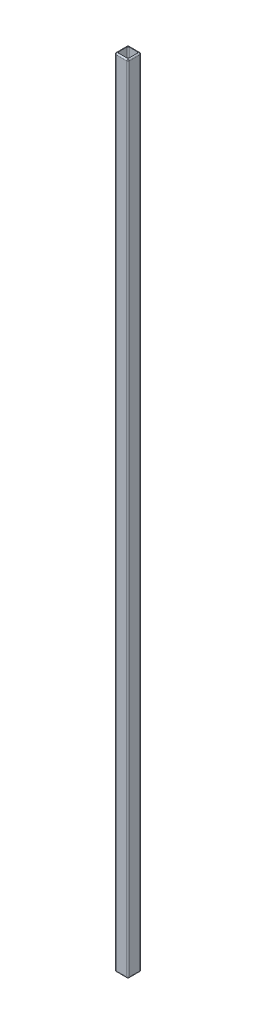
ISO-10303-21;
HEADER;
FILE_DESCRIPTION(('STEP AP214'),'2;1');
FILE_NAME('part.step','',(''),(''),'','','');
FILE_SCHEMA(('AUTOMOTIVE_DESIGN { 1 0 10303 214 1 1 1 1 }'));
ENDSEC;
DATA;
#1=APPLICATION_CONTEXT('core data for automotive mechanical design processes');
#2=APPLICATION_PROTOCOL_DEFINITION('international standard','automotive_design',2000,#1);
#3=PRODUCT_CONTEXT('',#1,'mechanical');
#4=PRODUCT('Part','Part','',(#3));
#5=PRODUCT_RELATED_PRODUCT_CATEGORY('part','',(#4));
#6=PRODUCT_DEFINITION_FORMATION('','',#4);
#7=PRODUCT_DEFINITION_CONTEXT('part definition',#1,'design');
#8=PRODUCT_DEFINITION('design','',#6,#7);
#9=PRODUCT_DEFINITION_SHAPE('','',#8);
#10=(LENGTH_UNIT() NAMED_UNIT(*) SI_UNIT(.MILLI.,.METRE.));
#11=(NAMED_UNIT(*) PLANE_ANGLE_UNIT() SI_UNIT($,.RADIAN.));
#12=(NAMED_UNIT(*) SI_UNIT($,.STERADIAN.) SOLID_ANGLE_UNIT());
#13=UNCERTAINTY_MEASURE_WITH_UNIT(LENGTH_MEASURE(1.E-05),#10,'distance_accuracy_value','');
#14=(GEOMETRIC_REPRESENTATION_CONTEXT(3) GLOBAL_UNCERTAINTY_ASSIGNED_CONTEXT((#13)) GLOBAL_UNIT_ASSIGNED_CONTEXT((#10,
#11,#12)) REPRESENTATION_CONTEXT('',''));
#15=CARTESIAN_POINT('',(0.,0.,0.));
#16=DIRECTION('',(0.,0.,1.));
#17=DIRECTION('',(1.,0.,0.));
#18=AXIS2_PLACEMENT_3D('',#15,#16,#17);
#19=CARTESIAN_POINT('',(0.,0.,0.));
#20=DIRECTION('',(0.,1.,0.));
#21=DIRECTION('',(0.,0.,1.));
#22=AXIS2_PLACEMENT_3D('',#19,#20,#21);
#23=PLANE('',#22);
#24=CARTESIAN_POINT('',(-7.62,0.,7.61999999999999));
#25=DIRECTION('',(0.,1.,0.));
#26=DIRECTION('',(0.,0.,1.));
#27=AXIS2_PLACEMENT_3D('',#24,#25,#26);
#28=CIRCLE('',#27,2.54);
#29=CARTESIAN_POINT('',(-10.16,0.,7.61999999999999));
#30=VERTEX_POINT('',#29);
#31=CARTESIAN_POINT('',(-7.62,0.,10.16));
#32=VERTEX_POINT('',#31);
#33=EDGE_CURVE('E283',#30,#32,#28,.T.);
#34=ORIENTED_EDGE('',*,*,#33,.T.);
#35=DIRECTION('',(-1.,0.,0.));
#36=VECTOR('',#35,1.);
#37=CARTESIAN_POINT('',(-10.16,0.,10.16));
#38=LINE('',#37,#36);
#39=CARTESIAN_POINT('',(-10.16,0.,10.16));
#40=VERTEX_POINT('',#39);
#41=EDGE_CURVE('E56',#32,#40,#38,.T.);
#42=ORIENTED_EDGE('',*,*,#41,.T.);
#43=DIRECTION('',(0.,0.,1.));
#44=VECTOR('',#43,1.);
#45=CARTESIAN_POINT('',(-10.16,0.,0.));
#46=LINE('',#45,#44);
#47=EDGE_CURVE('E363',#40,#30,#46,.F.);
#48=ORIENTED_EDGE('',*,*,#47,.T.);
#49=EDGE_LOOP('',(#34,#42,#48));
#50=FACE_BOUND('',#49,.T.);
#51=ADVANCED_FACE('F39',(#50),#23,.F.);
#52=DIRECTION('',(0.,0.,1.));
#53=VECTOR('',#52,1.);
#54=CARTESIAN_POINT('',(10.16,0.,10.16));
#55=LINE('',#54,#53);
#56=CARTESIAN_POINT('',(10.16,0.,7.61999999999999));
#57=VERTEX_POINT('',#56);
#58=CARTESIAN_POINT('',(10.16,0.,10.16));
#59=VERTEX_POINT('',#58);
#60=EDGE_CURVE('E64',#57,#59,#55,.T.);
#61=ORIENTED_EDGE('',*,*,#60,.T.);
#62=DIRECTION('',(-1.,0.,0.));
#63=VECTOR('',#62,1.);
#64=CARTESIAN_POINT('',(-10.16,0.,10.16));
#65=LINE('',#64,#63);
#66=CARTESIAN_POINT('',(7.62,0.,10.16));
#67=VERTEX_POINT('',#66);
#68=EDGE_CURVE('E361',#59,#67,#65,.T.);
#69=ORIENTED_EDGE('',*,*,#68,.T.);
#70=CARTESIAN_POINT('',(7.62,0.,7.61999999999999));
#71=DIRECTION('',(0.,1.,0.));
#72=DIRECTION('',(0.,0.,1.));
#73=AXIS2_PLACEMENT_3D('',#70,#71,#72);
#74=CIRCLE('',#73,2.54);
#75=EDGE_CURVE('E287',#67,#57,#74,.T.);
#76=ORIENTED_EDGE('',*,*,#75,.T.);
#77=EDGE_LOOP('',(#61,#69,#76));
#78=FACE_BOUND('',#77,.T.);
#79=ADVANCED_FACE('F467',(#78),#23,.F.);
#80=CARTESIAN_POINT('',(-7.62,0.,-7.62));
#81=DIRECTION('',(0.,1.,0.));
#82=DIRECTION('',(0.,0.,1.));
#83=AXIS2_PLACEMENT_3D('',#80,#81,#82);
#84=CIRCLE('',#83,2.54);
#85=CARTESIAN_POINT('',(-7.62,0.,-10.16));
#86=VERTEX_POINT('',#85);
#87=CARTESIAN_POINT('',(-10.16,0.,-7.62));
#88=VERTEX_POINT('',#87);
#89=EDGE_CURVE('E180',#86,#88,#84,.T.);
#90=ORIENTED_EDGE('',*,*,#89,.T.);
#91=DIRECTION('',(0.,0.,1.));
#92=VECTOR('',#91,1.);
#93=CARTESIAN_POINT('',(-10.16,0.,0.));
#94=LINE('',#93,#92);
#95=CARTESIAN_POINT('',(-10.16,0.,-10.16));
#96=VERTEX_POINT('',#95);
#97=EDGE_CURVE('E183',#88,#96,#94,.F.);
#98=ORIENTED_EDGE('',*,*,#97,.T.);
#99=DIRECTION('',(-1.,0.,0.));
#100=VECTOR('',#99,1.);
#101=CARTESIAN_POINT('',(0.,0.,-10.16));
#102=LINE('',#101,#100);
#103=EDGE_CURVE('E177',#96,#86,#102,.F.);
#104=ORIENTED_EDGE('',*,*,#103,.T.);
#105=EDGE_LOOP('',(#90,#98,#104));
#106=FACE_BOUND('',#105,.T.);
#107=ADVANCED_FACE('F179',(#106),#23,.F.);
#108=CARTESIAN_POINT('',(0.,1524.,0.));
#109=DIRECTION('',(0.,1.,0.));
#110=DIRECTION('',(0.,0.,1.));
#111=AXIS2_PLACEMENT_3D('',#108,#109,#110);
#112=PLANE('',#111);
#113=DIRECTION('',(0.,0.,1.));
#114=VECTOR('',#113,1.);
#115=CARTESIAN_POINT('',(-10.16,1524.,10.16));
#116=LINE('',#115,#114);
#117=CARTESIAN_POINT('',(-10.16,1524.,7.61999999999999));
#118=VERTEX_POINT('',#117);
#119=CARTESIAN_POINT('',(-10.16,1524.,10.16));
#120=VERTEX_POINT('',#119);
#121=EDGE_CURVE('E317',#118,#120,#116,.T.);
#122=ORIENTED_EDGE('',*,*,#121,.T.);
#123=DIRECTION('',(-1.,0.,0.));
#124=VECTOR('',#123,1.);
#125=CARTESIAN_POINT('',(0.,1524.,10.16));
#126=LINE('',#125,#124);
#127=CARTESIAN_POINT('',(-7.62,1524.,10.16));
#128=VERTEX_POINT('',#127);
#129=EDGE_CURVE('E319',#120,#128,#126,.F.);
#130=ORIENTED_EDGE('',*,*,#129,.T.);
#131=CARTESIAN_POINT('',(-7.62,1524.,7.61999999999999));
#132=DIRECTION('',(0.,1.,0.));
#133=DIRECTION('',(0.,0.,1.));
#134=AXIS2_PLACEMENT_3D('',#131,#132,#133);
#135=CIRCLE('',#134,2.54);
#136=EDGE_CURVE('E285',#128,#118,#135,.F.);
#137=ORIENTED_EDGE('',*,*,#136,.T.);
#138=EDGE_LOOP('',(#122,#130,#137));
#139=FACE_BOUND('',#138,.T.);
#140=ADVANCED_FACE('F438',(#139),#112,.T.);
#141=DIRECTION('',(-1.,0.,0.));
#142=VECTOR('',#141,1.);
#143=CARTESIAN_POINT('',(-10.16,1524.,-10.16));
#144=LINE('',#143,#142);
#145=CARTESIAN_POINT('',(-7.62,1524.,-10.16));
#146=VERTEX_POINT('',#145);
#147=CARTESIAN_POINT('',(-10.16,1524.,-10.16));
#148=VERTEX_POINT('',#147);
#149=EDGE_CURVE('E313',#146,#148,#144,.T.);
#150=ORIENTED_EDGE('',*,*,#149,.T.);
#151=DIRECTION('',(0.,0.,1.));
#152=VECTOR('',#151,1.);
#153=CARTESIAN_POINT('',(-10.16,1524.,10.16));
#154=LINE('',#153,#152);
#155=CARTESIAN_POINT('',(-10.16,1524.,-7.62));
#156=VERTEX_POINT('',#155);
#157=EDGE_CURVE('E315',#148,#156,#154,.T.);
#158=ORIENTED_EDGE('',*,*,#157,.T.);
#159=CARTESIAN_POINT('',(-7.62,1524.,-7.62));
#160=DIRECTION('',(0.,1.,0.));
#161=DIRECTION('',(0.,0.,1.));
#162=AXIS2_PLACEMENT_3D('',#159,#160,#161);
#163=CIRCLE('',#162,2.54);
#164=EDGE_CURVE('E200',#156,#146,#163,.F.);
#165=ORIENTED_EDGE('',*,*,#164,.T.);
#166=EDGE_LOOP('',(#150,#158,#165));
#167=FACE_BOUND('',#166,.T.);
#168=ADVANCED_FACE('F490',(#167),#112,.T.);
#169=CARTESIAN_POINT('',(7.62,1524.,7.61999999999999));
#170=DIRECTION('',(0.,1.,0.));
#171=DIRECTION('',(0.,0.,1.));
#172=AXIS2_PLACEMENT_3D('',#169,#170,#171);
#173=CIRCLE('',#172,2.54);
#174=CARTESIAN_POINT('',(10.16,1524.,7.61999999999999));
#175=VERTEX_POINT('',#174);
#176=CARTESIAN_POINT('',(7.62,1524.,10.16));
#177=VERTEX_POINT('',#176);
#178=EDGE_CURVE('E289',#175,#177,#173,.F.);
#179=ORIENTED_EDGE('',*,*,#178,.T.);
#180=DIRECTION('',(-1.,0.,0.));
#181=VECTOR('',#180,1.);
#182=CARTESIAN_POINT('',(0.,1524.,10.16));
#183=LINE('',#182,#181);
#184=CARTESIAN_POINT('',(10.16,1524.,10.16));
#185=VERTEX_POINT('',#184);
#186=EDGE_CURVE('E311',#177,#185,#183,.F.);
#187=ORIENTED_EDGE('',*,*,#186,.T.);
#188=DIRECTION('',(0.,0.,1.));
#189=VECTOR('',#188,1.);
#190=CARTESIAN_POINT('',(10.16,1524.,0.));
#191=LINE('',#190,#189);
#192=EDGE_CURVE('E309',#185,#175,#191,.F.);
#193=ORIENTED_EDGE('',*,*,#192,.T.);
#194=EDGE_LOOP('',(#179,#187,#193));
#195=FACE_BOUND('',#194,.T.);
#196=ADVANCED_FACE('F424',(#195),#112,.T.);
#197=CARTESIAN_POINT('',(12.7,1524.,-12.7));
#198=DIRECTION('',(0.,0.,1.));
#199=DIRECTION('',(1.,0.,0.));
#200=AXIS2_PLACEMENT_3D('',#197,#198,#199);
#201=PLANE('',#200);
#202=DIRECTION('',(0.,-1.,0.));
#203=VECTOR('',#202,1.);
#204=CARTESIAN_POINT('',(10.16,0.,-12.7));
#205=LINE('',#204,#203);
#206=CARTESIAN_POINT('',(10.16,1521.46,-12.7));
#207=VERTEX_POINT('',#206);
#208=CARTESIAN_POINT('',(10.16,2.53999999999999,-12.7));
#209=VERTEX_POINT('',#208);
#210=EDGE_CURVE('E211',#207,#209,#205,.T.);
#211=ORIENTED_EDGE('',*,*,#210,.T.);
#212=DIRECTION('',(-1.,0.,0.));
#213=VECTOR('',#212,1.);
#214=CARTESIAN_POINT('',(12.7,2.53999999999999,-12.7));
#215=LINE('',#214,#213);
#216=CARTESIAN_POINT('',(-10.16,2.53999999999999,-12.7));
#217=VERTEX_POINT('',#216);
#218=EDGE_CURVE('E11',#209,#217,#215,.T.);
#219=ORIENTED_EDGE('',*,*,#218,.T.);
#220=DIRECTION('',(0.,-1.,0.));
#221=VECTOR('',#220,1.);
#222=CARTESIAN_POINT('',(-10.16,1524.,-12.7));
#223=LINE('',#222,#221);
#224=CARTESIAN_POINT('',(-10.16,1521.46,-12.7));
#225=VERTEX_POINT('',#224);
#226=EDGE_CURVE('E256',#217,#225,#223,.F.);
#227=ORIENTED_EDGE('',*,*,#226,.T.);
#228=DIRECTION('',(-1.,0.,0.));
#229=VECTOR('',#228,1.);
#230=CARTESIAN_POINT('',(10.16,1521.46,-12.7));
#231=LINE('',#230,#229);
#232=EDGE_CURVE('E324',#225,#207,#231,.F.);
#233=ORIENTED_EDGE('',*,*,#232,.T.);
#234=EDGE_LOOP('',(#211,#219,#227,#233));
#235=FACE_BOUND('',#234,.T.);
#236=ADVANCED_FACE('F514',(#235),#201,.F.);
#237=CARTESIAN_POINT('',(-12.7,1524.,-12.7));
#238=DIRECTION('',(1.,0.,0.));
#239=DIRECTION('',(0.,0.,-1.));
#240=AXIS2_PLACEMENT_3D('',#237,#238,#239);
#241=PLANE('',#240);
#242=DIRECTION('',(0.,-1.,0.));
#243=VECTOR('',#242,1.);
#244=CARTESIAN_POINT('',(-12.7,1524.,-10.16));
#245=LINE('',#244,#243);
#246=CARTESIAN_POINT('',(-12.7,1521.46,-10.16));
#247=VERTEX_POINT('',#246);
#248=CARTESIAN_POINT('',(-12.7,2.53999999999999,-10.16));
#249=VERTEX_POINT('',#248);
#250=EDGE_CURVE('E246',#247,#249,#245,.T.);
#251=ORIENTED_EDGE('',*,*,#250,.T.);
#252=DIRECTION('',(0.,0.,1.));
#253=VECTOR('',#252,1.);
#254=CARTESIAN_POINT('',(-12.7,2.53999999999999,-12.7));
#255=LINE('',#254,#253);
#256=CARTESIAN_POINT('',(-12.7,2.53999999999999,10.16));
#257=VERTEX_POINT('',#256);
#258=EDGE_CURVE('E368',#249,#257,#255,.T.);
#259=ORIENTED_EDGE('',*,*,#258,.T.);
#260=DIRECTION('',(0.,-1.,0.));
#261=VECTOR('',#260,1.);
#262=CARTESIAN_POINT('',(-12.7,1524.,10.16));
#263=LINE('',#262,#261);
#264=CARTESIAN_POINT('',(-12.7,1521.46,10.16));
#265=VERTEX_POINT('',#264);
#266=EDGE_CURVE('E249',#257,#265,#263,.F.);
#267=ORIENTED_EDGE('',*,*,#266,.T.);
#268=DIRECTION('',(0.,0.,1.));
#269=VECTOR('',#268,1.);
#270=CARTESIAN_POINT('',(-12.7,1521.46,-10.16));
#271=LINE('',#270,#269);
#272=EDGE_CURVE('E322',#265,#247,#271,.F.);
#273=ORIENTED_EDGE('',*,*,#272,.T.);
#274=EDGE_LOOP('',(#251,#259,#267,#273));
#275=FACE_BOUND('',#274,.T.);
#276=ADVANCED_FACE('F628',(#275),#241,.F.);
#277=CARTESIAN_POINT('',(12.7,1524.,12.7));
#278=DIRECTION('',(0.,0.,1.));
#279=DIRECTION('',(1.,0.,0.));
#280=AXIS2_PLACEMENT_3D('',#277,#278,#279);
#281=PLANE('',#280);
#282=DIRECTION('',(0.,-1.,0.));
#283=VECTOR('',#282,1.);
#284=CARTESIAN_POINT('',(-10.16,0.,12.7));
#285=LINE('',#284,#283);
#286=CARTESIAN_POINT('',(-10.16,1521.46,12.7));
#287=VERTEX_POINT('',#286);
#288=CARTESIAN_POINT('',(-10.16,2.54,12.7));
#289=VERTEX_POINT('',#288);
#290=EDGE_CURVE('E243',#287,#289,#285,.T.);
#291=ORIENTED_EDGE('',*,*,#290,.T.);
#292=DIRECTION('',(-1.,0.,0.));
#293=VECTOR('',#292,1.);
#294=CARTESIAN_POINT('',(10.16,2.54,12.7));
#295=LINE('',#294,#293);
#296=CARTESIAN_POINT('',(10.16,2.53999999999999,12.7));
#297=VERTEX_POINT('',#296);
#298=EDGE_CURVE('E366',#289,#297,#295,.F.);
#299=ORIENTED_EDGE('',*,*,#298,.T.);
#300=DIRECTION('',(0.,-1.,0.));
#301=VECTOR('',#300,1.);
#302=CARTESIAN_POINT('',(10.16,1524.,12.7));
#303=LINE('',#302,#301);
#304=CARTESIAN_POINT('',(10.16,1521.46,12.7));
#305=VERTEX_POINT('',#304);
#306=EDGE_CURVE('E241',#297,#305,#303,.F.);
#307=ORIENTED_EDGE('',*,*,#306,.T.);
#308=DIRECTION('',(-1.,0.,0.));
#309=VECTOR('',#308,1.);
#310=CARTESIAN_POINT('',(12.7,1521.46,12.7));
#311=LINE('',#310,#309);
#312=EDGE_CURVE('E303',#305,#287,#311,.T.);
#313=ORIENTED_EDGE('',*,*,#312,.T.);
#314=EDGE_LOOP('',(#291,#299,#307,#313));
#315=FACE_BOUND('',#314,.T.);
#316=ADVANCED_FACE('F404',(#315),#281,.T.);
#317=CARTESIAN_POINT('',(12.7,1524.,-12.7));
#318=DIRECTION('',(1.,0.,0.));
#319=DIRECTION('',(0.,0.,-1.));
#320=AXIS2_PLACEMENT_3D('',#317,#318,#319);
#321=PLANE('',#320);
#322=DIRECTION('',(0.,-1.,0.));
#323=VECTOR('',#322,1.);
#324=CARTESIAN_POINT('',(12.7,1524.,10.16));
#325=LINE('',#324,#323);
#326=CARTESIAN_POINT('',(12.7,1521.46,10.16));
#327=VERTEX_POINT('',#326);
#328=CARTESIAN_POINT('',(12.7,2.53999999999999,10.16));
#329=VERTEX_POINT('',#328);
#330=EDGE_CURVE('E253',#327,#329,#325,.T.);
#331=ORIENTED_EDGE('',*,*,#330,.T.);
#332=DIRECTION('',(0.,0.,1.));
#333=VECTOR('',#332,1.);
#334=CARTESIAN_POINT('',(12.7,2.54,-10.16));
#335=LINE('',#334,#333);
#336=CARTESIAN_POINT('',(12.7,2.53999999999999,-10.16));
#337=VERTEX_POINT('',#336);
#338=EDGE_CURVE('E48',#329,#337,#335,.F.);
#339=ORIENTED_EDGE('',*,*,#338,.T.);
#340=DIRECTION('',(0.,-1.,0.));
#341=VECTOR('',#340,1.);
#342=CARTESIAN_POINT('',(12.7,1524.,-10.16));
#343=LINE('',#342,#341);
#344=CARTESIAN_POINT('',(12.7,1521.46,-10.16));
#345=VERTEX_POINT('',#344);
#346=EDGE_CURVE('E251',#337,#345,#343,.F.);
#347=ORIENTED_EDGE('',*,*,#346,.T.);
#348=DIRECTION('',(0.,0.,1.));
#349=VECTOR('',#348,1.);
#350=CARTESIAN_POINT('',(12.7,1521.46,-12.7));
#351=LINE('',#350,#349);
#352=EDGE_CURVE('E326',#345,#327,#351,.T.);
#353=ORIENTED_EDGE('',*,*,#352,.T.);
#354=EDGE_LOOP('',(#331,#339,#347,#353));
#355=FACE_BOUND('',#354,.T.);
#356=ADVANCED_FACE('F484',(#355),#321,.T.);
#357=DIRECTION('',(0.,0.,1.));
#358=VECTOR('',#357,1.);
#359=CARTESIAN_POINT('',(10.16,1524.,0.));
#360=LINE('',#359,#358);
#361=CARTESIAN_POINT('',(10.16,1524.,-7.62));
#362=VERTEX_POINT('',#361);
#363=CARTESIAN_POINT('',(10.16,1524.,-10.16));
#364=VERTEX_POINT('',#363);
#365=EDGE_CURVE('E305',#362,#364,#360,.F.);
#366=ORIENTED_EDGE('',*,*,#365,.T.);
#367=DIRECTION('',(-1.,0.,0.));
#368=VECTOR('',#367,1.);
#369=CARTESIAN_POINT('',(-10.16,1524.,-10.16));
#370=LINE('',#369,#368);
#371=CARTESIAN_POINT('',(7.62,1524.,-10.16));
#372=VERTEX_POINT('',#371);
#373=EDGE_CURVE('E307',#364,#372,#370,.T.);
#374=ORIENTED_EDGE('',*,*,#373,.T.);
#375=CARTESIAN_POINT('',(7.62,1524.,-7.62));
#376=DIRECTION('',(0.,1.,0.));
#377=DIRECTION('',(0.,0.,1.));
#378=AXIS2_PLACEMENT_3D('',#375,#376,#377);
#379=CIRCLE('',#378,2.54);
#380=EDGE_CURVE('E281',#372,#362,#379,.F.);
#381=ORIENTED_EDGE('',*,*,#380,.T.);
#382=EDGE_LOOP('',(#366,#374,#381));
#383=FACE_BOUND('',#382,.T.);
#384=ADVANCED_FACE('F476',(#383),#112,.T.);
#385=DIRECTION('',(-1.,0.,0.));
#386=VECTOR('',#385,1.);
#387=CARTESIAN_POINT('',(0.,0.,-10.16));
#388=LINE('',#387,#386);
#389=CARTESIAN_POINT('',(7.62,0.,-10.16));
#390=VERTEX_POINT('',#389);
#391=CARTESIAN_POINT('',(10.16,0.,-10.16));
#392=VERTEX_POINT('',#391);
#393=EDGE_CURVE('E216',#390,#392,#388,.F.);
#394=ORIENTED_EDGE('',*,*,#393,.T.);
#395=DIRECTION('',(0.,0.,1.));
#396=VECTOR('',#395,1.);
#397=CARTESIAN_POINT('',(10.16,0.,10.16));
#398=LINE('',#397,#396);
#399=CARTESIAN_POINT('',(10.16,0.,-7.62));
#400=VERTEX_POINT('',#399);
#401=EDGE_CURVE('E188',#392,#400,#398,.T.);
#402=ORIENTED_EDGE('',*,*,#401,.T.);
#403=CARTESIAN_POINT('',(7.62,0.,-7.62));
#404=DIRECTION('',(0.,1.,0.));
#405=DIRECTION('',(0.,0.,1.));
#406=AXIS2_PLACEMENT_3D('',#403,#404,#405);
#407=CIRCLE('',#406,2.54);
#408=EDGE_CURVE('E279',#400,#390,#407,.T.);
#409=ORIENTED_EDGE('',*,*,#408,.T.);
#410=EDGE_LOOP('',(#394,#402,#409));
#411=FACE_BOUND('',#410,.T.);
#412=ADVANCED_FACE('F469',(#411),#23,.F.);
#413=CARTESIAN_POINT('',(12.7,1524.,-10.16));
#414=DIRECTION('',(0.,0.,1.));
#415=DIRECTION('',(1.,0.,0.));
#416=AXIS2_PLACEMENT_3D('',#413,#414,#415);
#417=PLANE('',#416);
#418=DIRECTION('',(-1.,0.,0.));
#419=VECTOR('',#418,1.);
#420=CARTESIAN_POINT('',(12.7,0.,-10.16));
#421=LINE('',#420,#419);
#422=EDGE_CURVE('E206',#390,#86,#421,.T.);
#423=ORIENTED_EDGE('',*,*,#422,.F.);
#424=DIRECTION('',(0.,-1.,0.));
#425=VECTOR('',#424,1.);
#426=CARTESIAN_POINT('',(7.62,1524.,-10.16));
#427=LINE('',#426,#425);
#428=EDGE_CURVE('E268',#390,#372,#427,.F.);
#429=ORIENTED_EDGE('',*,*,#428,.T.);
#430=DIRECTION('',(-1.,0.,0.));
#431=VECTOR('',#430,1.);
#432=CARTESIAN_POINT('',(12.7,1524.,-10.16));
#433=LINE('',#432,#431);
#434=EDGE_CURVE('E209',#372,#146,#433,.T.);
#435=ORIENTED_EDGE('',*,*,#434,.T.);
#436=DIRECTION('',(0.,-1.,0.));
#437=VECTOR('',#436,1.);
#438=CARTESIAN_POINT('',(-7.62,0.,-10.16));
#439=LINE('',#438,#437);
#440=EDGE_CURVE('E196',#146,#86,#439,.T.);
#441=ORIENTED_EDGE('',*,*,#440,.T.);
#442=EDGE_LOOP('',(#423,#429,#435,#441));
#443=FACE_BOUND('',#442,.T.);
#444=ADVANCED_FACE('F204',(#443),#417,.T.);
#445=CARTESIAN_POINT('',(-10.16,1524.,-12.7));
#446=DIRECTION('',(1.,0.,0.));
#447=DIRECTION('',(0.,0.,-1.));
#448=AXIS2_PLACEMENT_3D('',#445,#446,#447);
#449=PLANE('',#448);
#450=DIRECTION('',(0.,0.,1.));
#451=VECTOR('',#450,1.);
#452=CARTESIAN_POINT('',(-10.16,1524.,-12.7));
#453=LINE('',#452,#451);
#454=EDGE_CURVE('E233',#156,#118,#453,.T.);
#455=ORIENTED_EDGE('',*,*,#454,.T.);
#456=DIRECTION('',(0.,-1.,0.));
#457=VECTOR('',#456,1.);
#458=CARTESIAN_POINT('',(-10.16,1524.,7.61999999999999));
#459=LINE('',#458,#457);
#460=EDGE_CURVE('E270',#118,#30,#459,.T.);
#461=ORIENTED_EDGE('',*,*,#460,.T.);
#462=DIRECTION('',(0.,0.,1.));
#463=VECTOR('',#462,1.);
#464=CARTESIAN_POINT('',(-10.16,0.,-12.7));
#465=LINE('',#464,#463);
#466=EDGE_CURVE('E217',#88,#30,#465,.T.);
#467=ORIENTED_EDGE('',*,*,#466,.F.);
#468=DIRECTION('',(0.,-1.,0.));
#469=VECTOR('',#468,1.);
#470=CARTESIAN_POINT('',(-10.16,1524.,-7.62));
#471=LINE('',#470,#469);
#472=EDGE_CURVE('E199',#88,#156,#471,.F.);
#473=ORIENTED_EDGE('',*,*,#472,.T.);
#474=EDGE_LOOP('',(#455,#461,#467,#473));
#475=FACE_BOUND('',#474,.T.);
#476=ADVANCED_FACE('F482',(#475),#449,.T.);
#477=CARTESIAN_POINT('',(12.7,1524.,10.16));
#478=DIRECTION('',(0.,0.,1.));
#479=DIRECTION('',(1.,0.,0.));
#480=AXIS2_PLACEMENT_3D('',#477,#478,#479);
#481=PLANE('',#480);
#482=DIRECTION('',(-1.,0.,0.));
#483=VECTOR('',#482,1.);
#484=CARTESIAN_POINT('',(12.7,0.,10.16));
#485=LINE('',#484,#483);
#486=EDGE_CURVE('E221',#67,#32,#485,.T.);
#487=ORIENTED_EDGE('',*,*,#486,.T.);
#488=DIRECTION('',(0.,-1.,0.));
#489=VECTOR('',#488,1.);
#490=CARTESIAN_POINT('',(-7.62,1524.,10.16));
#491=LINE('',#490,#489);
#492=EDGE_CURVE('E276',#32,#128,#491,.F.);
#493=ORIENTED_EDGE('',*,*,#492,.T.);
#494=DIRECTION('',(-1.,0.,0.));
#495=VECTOR('',#494,1.);
#496=CARTESIAN_POINT('',(12.7,1524.,10.16));
#497=LINE('',#496,#495);
#498=EDGE_CURVE('E236',#177,#128,#497,.T.);
#499=ORIENTED_EDGE('',*,*,#498,.F.);
#500=DIRECTION('',(0.,-1.,0.));
#501=VECTOR('',#500,1.);
#502=CARTESIAN_POINT('',(7.62,0.,10.16));
#503=LINE('',#502,#501);
#504=EDGE_CURVE('E273',#177,#67,#503,.T.);
#505=ORIENTED_EDGE('',*,*,#504,.T.);
#506=EDGE_LOOP('',(#487,#493,#499,#505));
#507=FACE_BOUND('',#506,.T.);
#508=ADVANCED_FACE('F442',(#507),#481,.F.);
#509=CARTESIAN_POINT('',(10.16,1524.,-12.7));
#510=DIRECTION('',(1.,0.,0.));
#511=DIRECTION('',(0.,0.,-1.));
#512=AXIS2_PLACEMENT_3D('',#509,#510,#511);
#513=PLANE('',#512);
#514=DIRECTION('',(0.,0.,1.));
#515=VECTOR('',#514,1.);
#516=CARTESIAN_POINT('',(10.16,1524.,-12.7));
#517=LINE('',#516,#515);
#518=EDGE_CURVE('E238',#362,#175,#517,.T.);
#519=ORIENTED_EDGE('',*,*,#518,.F.);
#520=DIRECTION('',(0.,-1.,0.));
#521=VECTOR('',#520,1.);
#522=CARTESIAN_POINT('',(10.16,1524.,-7.62));
#523=LINE('',#522,#521);
#524=EDGE_CURVE('E265',#362,#400,#523,.T.);
#525=ORIENTED_EDGE('',*,*,#524,.T.);
#526=DIRECTION('',(0.,0.,1.));
#527=VECTOR('',#526,1.);
#528=CARTESIAN_POINT('',(10.16,0.,-12.7));
#529=LINE('',#528,#527);
#530=EDGE_CURVE('E227',#400,#57,#529,.T.);
#531=ORIENTED_EDGE('',*,*,#530,.T.);
#532=DIRECTION('',(0.,-1.,0.));
#533=VECTOR('',#532,1.);
#534=CARTESIAN_POINT('',(10.16,1524.,7.61999999999999));
#535=LINE('',#534,#533);
#536=EDGE_CURVE('E262',#57,#175,#535,.F.);
#537=ORIENTED_EDGE('',*,*,#536,.T.);
#538=EDGE_LOOP('',(#519,#525,#531,#537));
#539=FACE_BOUND('',#538,.T.);
#540=ADVANCED_FACE('F429',(#539),#513,.F.);
#541=CARTESIAN_POINT('',(-10.16,1524.,10.16));
#542=DIRECTION('',(0.,1.,0.));
#543=DIRECTION('',(0.,0.,1.));
#544=AXIS2_PLACEMENT_3D('',#541,#542,#543);
#545=CYLINDRICAL_SURFACE('',#544,2.54);
#546=ORIENTED_EDGE('',*,*,#266,.F.);
#547=CARTESIAN_POINT('',(-10.16,2.53999999999999,10.16));
#548=DIRECTION('',(0.,1.,0.));
#549=DIRECTION('',(0.,0.,1.));
#550=AXIS2_PLACEMENT_3D('',#547,#548,#549);
#551=CIRCLE('',#550,2.54);
#552=EDGE_CURVE('E353',#257,#289,#551,.T.);
#553=ORIENTED_EDGE('',*,*,#552,.T.);
#554=ORIENTED_EDGE('',*,*,#290,.F.);
#555=CARTESIAN_POINT('',(-10.16,1521.46,10.16));
#556=DIRECTION('',(0.,1.,0.));
#557=DIRECTION('',(0.,0.,1.));
#558=AXIS2_PLACEMENT_3D('',#555,#556,#557);
#559=CIRCLE('',#558,2.54);
#560=EDGE_CURVE('E297',#287,#265,#559,.F.);
#561=ORIENTED_EDGE('',*,*,#560,.T.);
#562=EDGE_LOOP('',(#546,#553,#554,#561));
#563=FACE_BOUND('',#562,.T.);
#564=ADVANCED_FACE('F401',(#563),#545,.T.);
#565=CARTESIAN_POINT('',(10.16,1524.,10.16));
#566=DIRECTION('',(0.,-1.,0.));
#567=DIRECTION('',(0.,0.,-1.));
#568=AXIS2_PLACEMENT_3D('',#565,#566,#567);
#569=CYLINDRICAL_SURFACE('',#568,2.54);
#570=ORIENTED_EDGE('',*,*,#306,.F.);
#571=CARTESIAN_POINT('',(10.16,2.53999999999999,10.16));
#572=DIRECTION('',(0.,-1.,0.));
#573=DIRECTION('',(0.,0.,-1.));
#574=AXIS2_PLACEMENT_3D('',#571,#572,#573);
#575=CIRCLE('',#574,2.54);
#576=EDGE_CURVE('E351',#297,#329,#575,.F.);
#577=ORIENTED_EDGE('',*,*,#576,.T.);
#578=ORIENTED_EDGE('',*,*,#330,.F.);
#579=CARTESIAN_POINT('',(10.16,1521.46,10.16));
#580=DIRECTION('',(0.,-1.,0.));
#581=DIRECTION('',(0.,0.,-1.));
#582=AXIS2_PLACEMENT_3D('',#579,#580,#581);
#583=CIRCLE('',#582,2.54);
#584=EDGE_CURVE('E300',#327,#305,#583,.T.);
#585=ORIENTED_EDGE('',*,*,#584,.T.);
#586=EDGE_LOOP('',(#570,#577,#578,#585));
#587=FACE_BOUND('',#586,.T.);
#588=ADVANCED_FACE('F528',(#587),#569,.T.);
#589=CARTESIAN_POINT('',(10.16,1524.,-10.16));
#590=DIRECTION('',(0.,1.,0.));
#591=DIRECTION('',(0.,0.,1.));
#592=AXIS2_PLACEMENT_3D('',#589,#590,#591);
#593=CYLINDRICAL_SURFACE('',#592,2.54);
#594=ORIENTED_EDGE('',*,*,#346,.F.);
#595=CARTESIAN_POINT('',(10.16,2.53999999999999,-10.16));
#596=DIRECTION('',(0.,1.,0.));
#597=DIRECTION('',(0.,0.,1.));
#598=AXIS2_PLACEMENT_3D('',#595,#596,#597);
#599=CIRCLE('',#598,2.54);
#600=EDGE_CURVE('E328',#337,#209,#599,.T.);
#601=ORIENTED_EDGE('',*,*,#600,.T.);
#602=ORIENTED_EDGE('',*,*,#210,.F.);
#603=CARTESIAN_POINT('',(10.16,1521.46,-10.16));
#604=DIRECTION('',(0.,1.,0.));
#605=DIRECTION('',(0.,0.,1.));
#606=AXIS2_PLACEMENT_3D('',#603,#604,#605);
#607=CIRCLE('',#606,2.54);
#608=EDGE_CURVE('E291',#207,#345,#607,.F.);
#609=ORIENTED_EDGE('',*,*,#608,.T.);
#610=EDGE_LOOP('',(#594,#601,#602,#609));
#611=FACE_BOUND('',#610,.T.);
#612=ADVANCED_FACE('F519',(#611),#593,.T.);
#613=CARTESIAN_POINT('',(-10.16,1524.,-10.16));
#614=DIRECTION('',(0.,-1.,0.));
#615=DIRECTION('',(0.,0.,-1.));
#616=AXIS2_PLACEMENT_3D('',#613,#614,#615);
#617=CYLINDRICAL_SURFACE('',#616,2.54);
#618=ORIENTED_EDGE('',*,*,#226,.F.);
#619=CARTESIAN_POINT('',(-10.16,2.53999999999999,-10.16));
#620=DIRECTION('',(0.,-1.,0.));
#621=DIRECTION('',(0.,0.,-1.));
#622=AXIS2_PLACEMENT_3D('',#619,#620,#621);
#623=CIRCLE('',#622,2.54);
#624=EDGE_CURVE('E355',#217,#249,#623,.F.);
#625=ORIENTED_EDGE('',*,*,#624,.T.);
#626=ORIENTED_EDGE('',*,*,#250,.F.);
#627=CARTESIAN_POINT('',(-10.16,1521.46,-10.16));
#628=DIRECTION('',(0.,-1.,0.));
#629=DIRECTION('',(0.,0.,-1.));
#630=AXIS2_PLACEMENT_3D('',#627,#628,#629);
#631=CIRCLE('',#630,2.54);
#632=EDGE_CURVE('E294',#247,#225,#631,.T.);
#633=ORIENTED_EDGE('',*,*,#632,.T.);
#634=EDGE_LOOP('',(#618,#625,#626,#633));
#635=FACE_BOUND('',#634,.T.);
#636=ADVANCED_FACE('F544',(#635),#617,.T.);
#637=CARTESIAN_POINT('',(-7.62,1524.,-7.62));
#638=DIRECTION('',(0.,1.,0.));
#639=DIRECTION('',(0.,0.,1.));
#640=AXIS2_PLACEMENT_3D('',#637,#638,#639);
#641=CYLINDRICAL_SURFACE('',#640,2.54);
#642=ORIENTED_EDGE('',*,*,#164,.F.);
#643=ORIENTED_EDGE('',*,*,#472,.F.);
#644=ORIENTED_EDGE('',*,*,#89,.F.);
#645=ORIENTED_EDGE('',*,*,#440,.F.);
#646=EDGE_LOOP('',(#642,#643,#644,#645));
#647=FACE_BOUND('',#646,.T.);
#648=ADVANCED_FACE('F195',(#647),#641,.F.);
#649=CARTESIAN_POINT('',(7.62,1524.,-7.62));
#650=DIRECTION('',(0.,-1.,0.));
#651=DIRECTION('',(0.,0.,-1.));
#652=AXIS2_PLACEMENT_3D('',#649,#650,#651);
#653=CYLINDRICAL_SURFACE('',#652,2.54);
#654=ORIENTED_EDGE('',*,*,#380,.F.);
#655=ORIENTED_EDGE('',*,*,#428,.F.);
#656=ORIENTED_EDGE('',*,*,#408,.F.);
#657=ORIENTED_EDGE('',*,*,#524,.F.);
#658=EDGE_LOOP('',(#654,#655,#656,#657));
#659=FACE_BOUND('',#658,.T.);
#660=ADVANCED_FACE('F721',(#659),#653,.F.);
#661=CARTESIAN_POINT('',(-7.62,1524.,7.61999999999999));
#662=DIRECTION('',(0.,-1.,0.));
#663=DIRECTION('',(0.,0.,-1.));
#664=AXIS2_PLACEMENT_3D('',#661,#662,#663);
#665=CYLINDRICAL_SURFACE('',#664,2.54);
#666=ORIENTED_EDGE('',*,*,#136,.F.);
#667=ORIENTED_EDGE('',*,*,#492,.F.);
#668=ORIENTED_EDGE('',*,*,#33,.F.);
#669=ORIENTED_EDGE('',*,*,#460,.F.);
#670=EDGE_LOOP('',(#666,#667,#668,#669));
#671=FACE_BOUND('',#670,.T.);
#672=ADVANCED_FACE('F446',(#671),#665,.F.);
#673=CARTESIAN_POINT('',(7.62,1524.,7.61999999999999));
#674=DIRECTION('',(0.,1.,0.));
#675=DIRECTION('',(0.,0.,1.));
#676=AXIS2_PLACEMENT_3D('',#673,#674,#675);
#677=CYLINDRICAL_SURFACE('',#676,2.54);
#678=ORIENTED_EDGE('',*,*,#178,.F.);
#679=ORIENTED_EDGE('',*,*,#536,.F.);
#680=ORIENTED_EDGE('',*,*,#75,.F.);
#681=ORIENTED_EDGE('',*,*,#504,.F.);
#682=EDGE_LOOP('',(#678,#679,#680,#681));
#683=FACE_BOUND('',#682,.T.);
#684=ADVANCED_FACE('F435',(#683),#677,.F.);
#685=CARTESIAN_POINT('',(-10.16,1521.46,10.16));
#686=DIRECTION('',(0.,1.,0.));
#687=DIRECTION('',(0.,0.,1.));
#688=AXIS2_PLACEMENT_3D('',#685,#686,#687);
#689=SPHERICAL_SURFACE('',#688,2.54);
#690=CARTESIAN_POINT('',(-10.16,1521.46,10.16));
#691=DIRECTION('',(0.,0.,-1.));
#692=DIRECTION('',(-1.,0.,0.));
#693=AXIS2_PLACEMENT_3D('',#690,#691,#692);
#694=CIRCLE('',#693,2.54);
#695=EDGE_CURVE('E224',#265,#120,#694,.T.);
#696=ORIENTED_EDGE('',*,*,#695,.F.);
#697=ORIENTED_EDGE('',*,*,#560,.F.);
#698=CARTESIAN_POINT('',(-10.16,1521.46,10.16));
#699=DIRECTION('',(1.,0.,0.));
#700=DIRECTION('',(0.,0.,-1.));
#701=AXIS2_PLACEMENT_3D('',#698,#699,#700);
#702=CIRCLE('',#701,2.54);
#703=EDGE_CURVE('E218',#120,#287,#702,.T.);
#704=ORIENTED_EDGE('',*,*,#703,.F.);
#705=EDGE_LOOP('',(#696,#697,#704));
#706=FACE_BOUND('',#705,.T.);
#707=ADVANCED_FACE('F456',(#706),#689,.T.);
#708=CARTESIAN_POINT('',(12.7,1521.46,10.16));
#709=DIRECTION('',(-1.,0.,0.));
#710=DIRECTION('',(0.,0.,1.));
#711=AXIS2_PLACEMENT_3D('',#708,#709,#710);
#712=CYLINDRICAL_SURFACE('',#711,2.54);
#713=ORIENTED_EDGE('',*,*,#703,.T.);
#714=ORIENTED_EDGE('',*,*,#312,.F.);
#715=CARTESIAN_POINT('',(10.16,1521.46,10.16));
#716=DIRECTION('',(1.,0.,0.));
#717=DIRECTION('',(0.,0.,-1.));
#718=AXIS2_PLACEMENT_3D('',#715,#716,#717);
#719=CIRCLE('',#718,2.54);
#720=EDGE_CURVE('E344',#185,#305,#719,.T.);
#721=ORIENTED_EDGE('',*,*,#720,.F.);
#722=ORIENTED_EDGE('',*,*,#186,.F.);
#723=ORIENTED_EDGE('',*,*,#498,.T.);
#724=ORIENTED_EDGE('',*,*,#129,.F.);
#725=EDGE_LOOP('',(#713,#714,#721,#722,#723,#724));
#726=FACE_BOUND('',#725,.T.);
#727=ADVANCED_FACE('F409',(#726),#712,.T.);
#728=CARTESIAN_POINT('',(-10.16,1521.46,0.));
#729=DIRECTION('',(0.,0.,-1.));
#730=DIRECTION('',(-1.,0.,0.));
#731=AXIS2_PLACEMENT_3D('',#728,#729,#730);
#732=CYLINDRICAL_SURFACE('',#731,2.54);
#733=ORIENTED_EDGE('',*,*,#454,.F.);
#734=ORIENTED_EDGE('',*,*,#157,.F.);
#735=CARTESIAN_POINT('',(-10.16,1521.46,-10.16));
#736=DIRECTION('',(0.,0.,-1.));
#737=DIRECTION('',(-1.,0.,0.));
#738=AXIS2_PLACEMENT_3D('',#735,#736,#737);
#739=CIRCLE('',#738,2.54);
#740=EDGE_CURVE('E341',#247,#148,#739,.T.);
#741=ORIENTED_EDGE('',*,*,#740,.F.);
#742=ORIENTED_EDGE('',*,*,#272,.F.);
#743=ORIENTED_EDGE('',*,*,#695,.T.);
#744=ORIENTED_EDGE('',*,*,#121,.F.);
#745=EDGE_LOOP('',(#733,#734,#741,#742,#743,#744));
#746=FACE_BOUND('',#745,.T.);
#747=ADVANCED_FACE('F450',(#746),#732,.T.);
#748=CARTESIAN_POINT('',(10.16,1521.46,10.16));
#749=DIRECTION('',(0.,1.,0.));
#750=DIRECTION('',(0.,0.,1.));
#751=AXIS2_PLACEMENT_3D('',#748,#749,#750);
#752=SPHERICAL_SURFACE('',#751,2.54);
#753=ORIENTED_EDGE('',*,*,#720,.T.);
#754=ORIENTED_EDGE('',*,*,#584,.F.);
#755=CARTESIAN_POINT('',(10.16,1521.46,10.16));
#756=DIRECTION('',(0.,0.,-1.));
#757=DIRECTION('',(-1.,0.,0.));
#758=AXIS2_PLACEMENT_3D('',#755,#756,#757);
#759=CIRCLE('',#758,2.54);
#760=EDGE_CURVE('E338',#185,#327,#759,.T.);
#761=ORIENTED_EDGE('',*,*,#760,.F.);
#762=EDGE_LOOP('',(#753,#754,#761));
#763=FACE_BOUND('',#762,.T.);
#764=ADVANCED_FACE('F416',(#763),#752,.T.);
#765=CARTESIAN_POINT('',(-10.16,1521.46,-10.16));
#766=DIRECTION('',(0.,1.,0.));
#767=DIRECTION('',(0.,0.,1.));
#768=AXIS2_PLACEMENT_3D('',#765,#766,#767);
#769=SPHERICAL_SURFACE('',#768,2.54);
#770=ORIENTED_EDGE('',*,*,#632,.F.);
#771=ORIENTED_EDGE('',*,*,#740,.T.);
#772=CARTESIAN_POINT('',(-10.16,1521.46,-10.16));
#773=DIRECTION('',(1.,0.,0.));
#774=DIRECTION('',(0.,0.,-1.));
#775=AXIS2_PLACEMENT_3D('',#772,#773,#774);
#776=CIRCLE('',#775,2.54);
#777=EDGE_CURVE('E335',#225,#148,#776,.T.);
#778=ORIENTED_EDGE('',*,*,#777,.F.);
#779=EDGE_LOOP('',(#770,#771,#778));
#780=FACE_BOUND('',#779,.T.);
#781=ADVANCED_FACE('F506',(#780),#769,.T.);
#782=CARTESIAN_POINT('',(10.16,1521.46,-12.7));
#783=DIRECTION('',(0.,0.,1.));
#784=DIRECTION('',(1.,0.,0.));
#785=AXIS2_PLACEMENT_3D('',#782,#783,#784);
#786=CYLINDRICAL_SURFACE('',#785,2.54);
#787=ORIENTED_EDGE('',*,*,#760,.T.);
#788=ORIENTED_EDGE('',*,*,#352,.F.);
#789=CARTESIAN_POINT('',(10.16,1521.46,-10.16));
#790=DIRECTION('',(0.,0.,-1.));
#791=DIRECTION('',(-1.,0.,0.));
#792=AXIS2_PLACEMENT_3D('',#789,#790,#791);
#793=CIRCLE('',#792,2.54);
#794=EDGE_CURVE('E332',#364,#345,#793,.T.);
#795=ORIENTED_EDGE('',*,*,#794,.F.);
#796=ORIENTED_EDGE('',*,*,#365,.F.);
#797=ORIENTED_EDGE('',*,*,#518,.T.);
#798=ORIENTED_EDGE('',*,*,#192,.F.);
#799=EDGE_LOOP('',(#787,#788,#795,#796,#797,#798));
#800=FACE_BOUND('',#799,.T.);
#801=ADVANCED_FACE('F420',(#800),#786,.T.);
#802=CARTESIAN_POINT('',(0.,1521.46,-10.16));
#803=DIRECTION('',(1.,0.,0.));
#804=DIRECTION('',(0.,0.,-1.));
#805=AXIS2_PLACEMENT_3D('',#802,#803,#804);
#806=CYLINDRICAL_SURFACE('',#805,2.54);
#807=ORIENTED_EDGE('',*,*,#434,.F.);
#808=ORIENTED_EDGE('',*,*,#373,.F.);
#809=CARTESIAN_POINT('',(10.16,1521.46,-10.16));
#810=DIRECTION('',(1.,0.,0.));
#811=DIRECTION('',(0.,0.,-1.));
#812=AXIS2_PLACEMENT_3D('',#809,#810,#811);
#813=CIRCLE('',#812,2.54);
#814=EDGE_CURVE('E329',#207,#364,#813,.T.);
#815=ORIENTED_EDGE('',*,*,#814,.F.);
#816=ORIENTED_EDGE('',*,*,#232,.F.);
#817=ORIENTED_EDGE('',*,*,#777,.T.);
#818=ORIENTED_EDGE('',*,*,#149,.F.);
#819=EDGE_LOOP('',(#807,#808,#815,#816,#817,#818));
#820=FACE_BOUND('',#819,.T.);
#821=ADVANCED_FACE('F509',(#820),#806,.T.);
#822=CARTESIAN_POINT('',(10.16,1521.46,-10.16));
#823=DIRECTION('',(0.,1.,0.));
#824=DIRECTION('',(0.,0.,1.));
#825=AXIS2_PLACEMENT_3D('',#822,#823,#824);
#826=SPHERICAL_SURFACE('',#825,2.54);
#827=ORIENTED_EDGE('',*,*,#794,.T.);
#828=ORIENTED_EDGE('',*,*,#608,.F.);
#829=ORIENTED_EDGE('',*,*,#814,.T.);
#830=EDGE_LOOP('',(#827,#828,#829));
#831=FACE_BOUND('',#830,.T.);
#832=ADVANCED_FACE('F522',(#831),#826,.T.);
#833=CARTESIAN_POINT('',(-10.16,2.53999999999999,10.16));
#834=DIRECTION('',(0.,1.,0.));
#835=DIRECTION('',(0.,0.,1.));
#836=AXIS2_PLACEMENT_3D('',#833,#834,#835);
#837=SPHERICAL_SURFACE('',#836,2.54);
#838=CARTESIAN_POINT('',(-10.16,2.53999999999999,10.16));
#839=DIRECTION('',(1.,0.,0.));
#840=DIRECTION('',(0.,0.,-1.));
#841=AXIS2_PLACEMENT_3D('',#838,#839,#840);
#842=CIRCLE('',#841,2.54);
#843=EDGE_CURVE('E386',#289,#40,#842,.T.);
#844=ORIENTED_EDGE('',*,*,#843,.F.);
#845=ORIENTED_EDGE('',*,*,#552,.F.);
#846=CARTESIAN_POINT('',(-10.16,2.53999999999999,10.16));
#847=DIRECTION('',(0.,0.,-1.));
#848=DIRECTION('',(-1.,0.,0.));
#849=AXIS2_PLACEMENT_3D('',#846,#847,#848);
#850=CIRCLE('',#849,2.54);
#851=EDGE_CURVE('E43',#40,#257,#850,.T.);
#852=ORIENTED_EDGE('',*,*,#851,.F.);
#853=EDGE_LOOP('',(#844,#845,#852));
#854=FACE_BOUND('',#853,.T.);
#855=ADVANCED_FACE('F41',(#854),#837,.T.);
#856=CARTESIAN_POINT('',(-10.16,2.53999999999999,-12.7));
#857=DIRECTION('',(0.,0.,1.));
#858=DIRECTION('',(1.,0.,0.));
#859=AXIS2_PLACEMENT_3D('',#856,#857,#858);
#860=CYLINDRICAL_SURFACE('',#859,2.54);
#861=ORIENTED_EDGE('',*,*,#851,.T.);
#862=ORIENTED_EDGE('',*,*,#258,.F.);
#863=CARTESIAN_POINT('',(-10.16,2.54,-10.16));
#864=DIRECTION('',(0.,0.,-1.));
#865=DIRECTION('',(-1.,0.,0.));
#866=AXIS2_PLACEMENT_3D('',#863,#864,#865);
#867=CIRCLE('',#866,2.54);
#868=EDGE_CURVE('E384',#96,#249,#867,.T.);
#869=ORIENTED_EDGE('',*,*,#868,.F.);
#870=ORIENTED_EDGE('',*,*,#97,.F.);
#871=ORIENTED_EDGE('',*,*,#466,.T.);
#872=ORIENTED_EDGE('',*,*,#47,.F.);
#873=EDGE_LOOP('',(#861,#862,#869,#870,#871,#872));
#874=FACE_BOUND('',#873,.T.);
#875=ADVANCED_FACE('F395',(#874),#860,.T.);
#876=CARTESIAN_POINT('',(0.,2.54,10.16));
#877=DIRECTION('',(1.,0.,0.));
#878=DIRECTION('',(0.,0.,-1.));
#879=AXIS2_PLACEMENT_3D('',#876,#877,#878);
#880=CYLINDRICAL_SURFACE('',#879,2.54);
#881=ORIENTED_EDGE('',*,*,#486,.F.);
#882=ORIENTED_EDGE('',*,*,#68,.F.);
#883=CARTESIAN_POINT('',(10.16,2.54,10.16));
#884=DIRECTION('',(1.,0.,0.));
#885=DIRECTION('',(0.,0.,-1.));
#886=AXIS2_PLACEMENT_3D('',#883,#884,#885);
#887=CIRCLE('',#886,2.54);
#888=EDGE_CURVE('E381',#297,#59,#887,.T.);
#889=ORIENTED_EDGE('',*,*,#888,.F.);
#890=ORIENTED_EDGE('',*,*,#298,.F.);
#891=ORIENTED_EDGE('',*,*,#843,.T.);
#892=ORIENTED_EDGE('',*,*,#41,.F.);
#893=EDGE_LOOP('',(#881,#882,#889,#890,#891,#892));
#894=FACE_BOUND('',#893,.T.);
#895=ADVANCED_FACE('F549',(#894),#880,.T.);
#896=CARTESIAN_POINT('',(-10.16,2.53999999999999,-10.16));
#897=DIRECTION('',(0.,1.,0.));
#898=DIRECTION('',(0.,0.,1.));
#899=AXIS2_PLACEMENT_3D('',#896,#897,#898);
#900=SPHERICAL_SURFACE('',#899,2.54);
#901=ORIENTED_EDGE('',*,*,#868,.T.);
#902=ORIENTED_EDGE('',*,*,#624,.F.);
#903=CARTESIAN_POINT('',(-10.16,2.53999999999999,-10.16));
#904=DIRECTION('',(1.,0.,0.));
#905=DIRECTION('',(0.,0.,-1.));
#906=AXIS2_PLACEMENT_3D('',#903,#904,#905);
#907=CIRCLE('',#906,2.54);
#908=EDGE_CURVE('E379',#96,#217,#907,.T.);
#909=ORIENTED_EDGE('',*,*,#908,.F.);
#910=EDGE_LOOP('',(#901,#902,#909));
#911=FACE_BOUND('',#910,.T.);
#912=ADVANCED_FACE('F547',(#911),#900,.T.);
#913=CARTESIAN_POINT('',(10.16,2.53999999999999,10.16));
#914=DIRECTION('',(0.,1.,0.));
#915=DIRECTION('',(0.,0.,1.));
#916=AXIS2_PLACEMENT_3D('',#913,#914,#915);
#917=SPHERICAL_SURFACE('',#916,2.54);
#918=ORIENTED_EDGE('',*,*,#576,.F.);
#919=ORIENTED_EDGE('',*,*,#888,.T.);
#920=CARTESIAN_POINT('',(10.16,2.53999999999999,10.16));
#921=DIRECTION('',(0.,0.,-1.));
#922=DIRECTION('',(-1.,0.,0.));
#923=AXIS2_PLACEMENT_3D('',#920,#921,#922);
#924=CIRCLE('',#923,2.54);
#925=EDGE_CURVE('E376',#329,#59,#924,.T.);
#926=ORIENTED_EDGE('',*,*,#925,.F.);
#927=EDGE_LOOP('',(#918,#919,#926));
#928=FACE_BOUND('',#927,.T.);
#929=ADVANCED_FACE('F532',(#928),#917,.T.);
#930=CARTESIAN_POINT('',(12.7,2.53999999999999,-10.16));
#931=DIRECTION('',(-1.,0.,0.));
#932=DIRECTION('',(0.,0.,1.));
#933=AXIS2_PLACEMENT_3D('',#930,#931,#932);
#934=CYLINDRICAL_SURFACE('',#933,2.54);
#935=ORIENTED_EDGE('',*,*,#908,.T.);
#936=ORIENTED_EDGE('',*,*,#218,.F.);
#937=CARTESIAN_POINT('',(10.16,2.54,-10.16));
#938=DIRECTION('',(1.,0.,0.));
#939=DIRECTION('',(0.,0.,-1.));
#940=AXIS2_PLACEMENT_3D('',#937,#938,#939);
#941=CIRCLE('',#940,2.54);
#942=EDGE_CURVE('E374',#392,#209,#941,.T.);
#943=ORIENTED_EDGE('',*,*,#942,.F.);
#944=ORIENTED_EDGE('',*,*,#393,.F.);
#945=ORIENTED_EDGE('',*,*,#422,.T.);
#946=ORIENTED_EDGE('',*,*,#103,.F.);
#947=EDGE_LOOP('',(#935,#936,#943,#944,#945,#946));
#948=FACE_BOUND('',#947,.T.);
#949=ADVANCED_FACE('F214',(#948),#934,.T.);
#950=CARTESIAN_POINT('',(10.16,2.54,0.));
#951=DIRECTION('',(0.,0.,-1.));
#952=DIRECTION('',(-1.,0.,0.));
#953=AXIS2_PLACEMENT_3D('',#950,#951,#952);
#954=CYLINDRICAL_SURFACE('',#953,2.54);
#955=ORIENTED_EDGE('',*,*,#530,.F.);
#956=ORIENTED_EDGE('',*,*,#401,.F.);
#957=CARTESIAN_POINT('',(10.16,2.54,-10.16));
#958=DIRECTION('',(0.,0.,-1.));
#959=DIRECTION('',(-1.,0.,0.));
#960=AXIS2_PLACEMENT_3D('',#957,#958,#959);
#961=CIRCLE('',#960,2.54);
#962=EDGE_CURVE('E371',#337,#392,#961,.T.);
#963=ORIENTED_EDGE('',*,*,#962,.F.);
#964=ORIENTED_EDGE('',*,*,#338,.F.);
#965=ORIENTED_EDGE('',*,*,#925,.T.);
#966=ORIENTED_EDGE('',*,*,#60,.F.);
#967=EDGE_LOOP('',(#955,#956,#963,#964,#965,#966));
#968=FACE_BOUND('',#967,.T.);
#969=ADVANCED_FACE('F536',(#968),#954,.T.);
#970=CARTESIAN_POINT('',(10.16,2.53999999999999,-10.16));
#971=DIRECTION('',(0.,1.,0.));
#972=DIRECTION('',(0.,0.,1.));
#973=AXIS2_PLACEMENT_3D('',#970,#971,#972);
#974=SPHERICAL_SURFACE('',#973,2.54);
#975=ORIENTED_EDGE('',*,*,#942,.T.);
#976=ORIENTED_EDGE('',*,*,#600,.F.);
#977=ORIENTED_EDGE('',*,*,#962,.T.);
#978=EDGE_LOOP('',(#975,#976,#977));
#979=FACE_BOUND('',#978,.T.);
#980=ADVANCED_FACE('F539',(#979),#974,.T.);
#981=CLOSED_SHELL('',(#51,#79,#107,#140,#168,#196,#236,#276,#316,#356,#384,#412,#444,#476,#508,
#540,#564,#588,#612,#636,#648,#660,#672,#684,#707,#727,#747,#764,#781,#801,#821,#832,#855,#875,
#895,#912,#929,#949,#969,#980));
#982=MANIFOLD_SOLID_BREP('B2',#981);
#983=ADVANCED_BREP_SHAPE_REPRESENTATION('',(#18,#982),#14);
#984=SHAPE_DEFINITION_REPRESENTATION(#9,#983);
ENDSEC;
END-ISO-10303-21;
